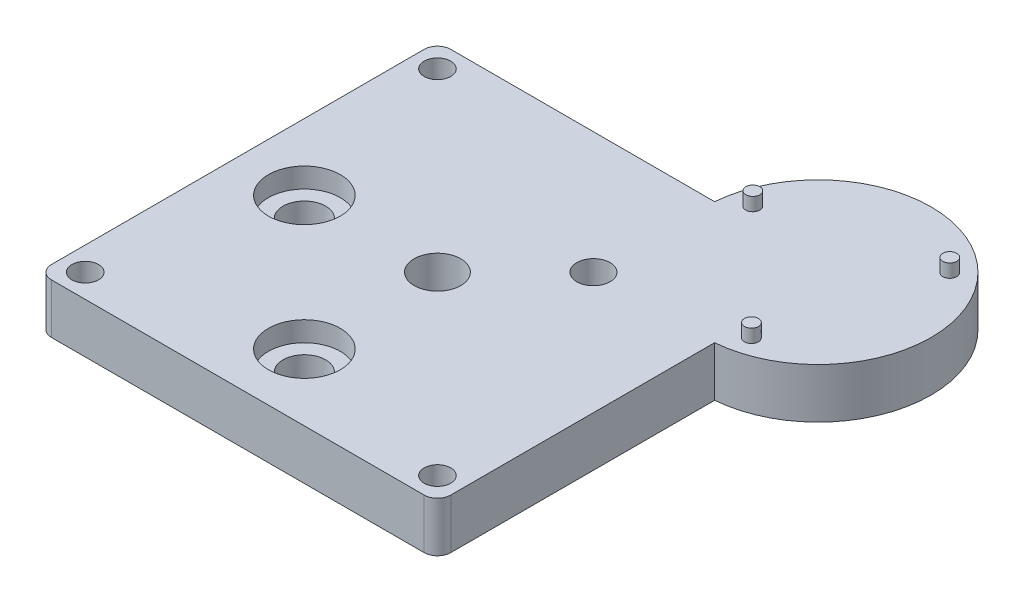
ISO-10303-21;
HEADER;
FILE_DESCRIPTION(('STEP AP214'),'2;1');
FILE_NAME('part.step','',(''),(''),'','','');
FILE_SCHEMA(('AUTOMOTIVE_DESIGN { 1 0 10303 214 1 1 1 1 }'));
ENDSEC;
DATA;
#1=APPLICATION_CONTEXT('core data for automotive mechanical design processes');
#2=APPLICATION_PROTOCOL_DEFINITION('international standard','automotive_design',2000,#1);
#3=PRODUCT_CONTEXT('',#1,'mechanical');
#4=PRODUCT('Part','Part','',(#3));
#5=PRODUCT_RELATED_PRODUCT_CATEGORY('part','',(#4));
#6=PRODUCT_DEFINITION_FORMATION('','',#4);
#7=PRODUCT_DEFINITION_CONTEXT('part definition',#1,'design');
#8=PRODUCT_DEFINITION('design','',#6,#7);
#9=PRODUCT_DEFINITION_SHAPE('','',#8);
#10=(LENGTH_UNIT() NAMED_UNIT(*) SI_UNIT(.MILLI.,.METRE.));
#11=(NAMED_UNIT(*) PLANE_ANGLE_UNIT() SI_UNIT($,.RADIAN.));
#12=(NAMED_UNIT(*) SI_UNIT($,.STERADIAN.) SOLID_ANGLE_UNIT());
#13=UNCERTAINTY_MEASURE_WITH_UNIT(LENGTH_MEASURE(1.E-05),#10,'distance_accuracy_value','');
#14=(GEOMETRIC_REPRESENTATION_CONTEXT(3) GLOBAL_UNCERTAINTY_ASSIGNED_CONTEXT((#13)) GLOBAL_UNIT_ASSIGNED_CONTEXT((#10,
#11,#12)) REPRESENTATION_CONTEXT('',''));
#15=CARTESIAN_POINT('',(0.,0.,0.));
#16=DIRECTION('',(0.,0.,1.));
#17=DIRECTION('',(1.,0.,0.));
#18=AXIS2_PLACEMENT_3D('',#15,#16,#17);
#19=CARTESIAN_POINT('',(38.1,9.525,-38.1));
#20=DIRECTION('',(-1.,0.,0.));
#21=DIRECTION('',(0.,0.,1.));
#22=AXIS2_PLACEMENT_3D('',#19,#20,#21);
#23=PLANE('',#22);
#24=DIRECTION('',(0.,0.,-1.));
#25=VECTOR('',#24,1.);
#26=CARTESIAN_POINT('',(38.1,0.,-38.1));
#27=LINE('',#26,#25);
#28=CARTESIAN_POINT('',(38.1,0.,35.56));
#29=VERTEX_POINT('',#28);
#30=CARTESIAN_POINT('',(38.1,0.,-14.7955));
#31=VERTEX_POINT('',#30);
#32=EDGE_CURVE('E130',#29,#31,#27,.T.);
#33=ORIENTED_EDGE('',*,*,#32,.T.);
#34=DIRECTION('',(0.,1.,0.));
#35=VECTOR('',#34,1.);
#36=CARTESIAN_POINT('',(38.1,-61.0657416232702,-14.7955));
#37=LINE('',#36,#35);
#38=CARTESIAN_POINT('',(38.1,9.525,-14.7955));
#39=VERTEX_POINT('',#38);
#40=EDGE_CURVE('E109',#31,#39,#37,.T.);
#41=ORIENTED_EDGE('',*,*,#40,.T.);
#42=DIRECTION('',(0.,0.,-1.));
#43=VECTOR('',#42,1.);
#44=CARTESIAN_POINT('',(38.1,9.525,-38.1));
#45=LINE('',#44,#43);
#46=CARTESIAN_POINT('',(38.1,9.525,35.56));
#47=VERTEX_POINT('',#46);
#48=EDGE_CURVE('E140',#47,#39,#45,.T.);
#49=ORIENTED_EDGE('',*,*,#48,.F.);
#50=DIRECTION('',(0.,-1.,0.));
#51=VECTOR('',#50,1.);
#52=CARTESIAN_POINT('',(38.1,9.525,35.56));
#53=LINE('',#52,#51);
#54=EDGE_CURVE('E157',#47,#29,#53,.T.);
#55=ORIENTED_EDGE('',*,*,#54,.T.);
#56=EDGE_LOOP('',(#33,#41,#49,#55));
#57=FACE_BOUND('',#56,.T.);
#58=ADVANCED_FACE('F38',(#57),#23,.F.);
#59=CARTESIAN_POINT('',(-38.1,9.525,-38.1));
#60=DIRECTION('',(0.,0.,1.));
#61=DIRECTION('',(1.,0.,0.));
#62=AXIS2_PLACEMENT_3D('',#59,#60,#61);
#63=PLANE('',#62);
#64=DIRECTION('',(-1.,0.,0.));
#65=VECTOR('',#64,1.);
#66=CARTESIAN_POINT('',(-38.1,9.525,-38.1));
#67=LINE('',#66,#65);
#68=CARTESIAN_POINT('',(14.7955,9.525,-38.1));
#69=VERTEX_POINT('',#68);
#70=CARTESIAN_POINT('',(-35.56,9.525,-38.1));
#71=VERTEX_POINT('',#70);
#72=EDGE_CURVE('E122',#69,#71,#67,.T.);
#73=ORIENTED_EDGE('',*,*,#72,.F.);
#74=DIRECTION('',(0.,1.,0.));
#75=VECTOR('',#74,1.);
#76=CARTESIAN_POINT('',(14.7955,-61.0657416232702,-38.1));
#77=LINE('',#76,#75);
#78=CARTESIAN_POINT('',(14.7955,0.,-38.1));
#79=VERTEX_POINT('',#78);
#80=EDGE_CURVE('E106',#69,#79,#77,.F.);
#81=ORIENTED_EDGE('',*,*,#80,.T.);
#82=DIRECTION('',(-1.,0.,0.));
#83=VECTOR('',#82,1.);
#84=CARTESIAN_POINT('',(-38.1,0.,-38.1));
#85=LINE('',#84,#83);
#86=CARTESIAN_POINT('',(-35.56,0.,-38.1));
#87=VERTEX_POINT('',#86);
#88=EDGE_CURVE('E120',#79,#87,#85,.T.);
#89=ORIENTED_EDGE('',*,*,#88,.T.);
#90=DIRECTION('',(0.,-1.,0.));
#91=VECTOR('',#90,1.);
#92=CARTESIAN_POINT('',(-35.56,9.525,-38.1));
#93=LINE('',#92,#91);
#94=EDGE_CURVE('E149',#87,#71,#93,.F.);
#95=ORIENTED_EDGE('',*,*,#94,.T.);
#96=EDGE_LOOP('',(#73,#81,#89,#95));
#97=FACE_BOUND('',#96,.T.);
#98=ADVANCED_FACE('F118',(#97),#63,.F.);
#99=CARTESIAN_POINT('',(-38.1,9.525,-38.1));
#100=DIRECTION('',(1.,0.,0.));
#101=DIRECTION('',(0.,0.,-1.));
#102=AXIS2_PLACEMENT_3D('',#99,#100,#101);
#103=PLANE('',#102);
#104=DIRECTION('',(0.,0.,1.));
#105=VECTOR('',#104,1.);
#106=CARTESIAN_POINT('',(-38.1,0.,-38.1));
#107=LINE('',#106,#105);
#108=CARTESIAN_POINT('',(-38.1,0.,-35.56));
#109=VERTEX_POINT('',#108);
#110=CARTESIAN_POINT('',(-38.1,0.,35.56));
#111=VERTEX_POINT('',#110);
#112=EDGE_CURVE('E129',#109,#111,#107,.T.);
#113=ORIENTED_EDGE('',*,*,#112,.T.);
#114=DIRECTION('',(0.,-1.,0.));
#115=VECTOR('',#114,1.);
#116=CARTESIAN_POINT('',(-38.1,9.525,35.56));
#117=LINE('',#116,#115);
#118=CARTESIAN_POINT('',(-38.1,9.525,35.56));
#119=VERTEX_POINT('',#118);
#120=EDGE_CURVE('E11',#111,#119,#117,.F.);
#121=ORIENTED_EDGE('',*,*,#120,.T.);
#122=DIRECTION('',(0.,0.,1.));
#123=VECTOR('',#122,1.);
#124=CARTESIAN_POINT('',(-38.1,9.525,-38.1));
#125=LINE('',#124,#123);
#126=CARTESIAN_POINT('',(-38.1,9.525,-35.56));
#127=VERTEX_POINT('',#126);
#128=EDGE_CURVE('E174',#127,#119,#125,.T.);
#129=ORIENTED_EDGE('',*,*,#128,.F.);
#130=DIRECTION('',(0.,-1.,0.));
#131=VECTOR('',#130,1.);
#132=CARTESIAN_POINT('',(-38.1,9.525,-35.56));
#133=LINE('',#132,#131);
#134=EDGE_CURVE('E46',#127,#109,#133,.T.);
#135=ORIENTED_EDGE('',*,*,#134,.T.);
#136=EDGE_LOOP('',(#113,#121,#129,#135));
#137=FACE_BOUND('',#136,.T.);
#138=ADVANCED_FACE('F172',(#137),#103,.F.);
#139=CARTESIAN_POINT('',(-38.1,9.525,38.1));
#140=DIRECTION('',(0.,0.,-1.));
#141=DIRECTION('',(-1.,0.,0.));
#142=AXIS2_PLACEMENT_3D('',#139,#140,#141);
#143=PLANE('',#142);
#144=DIRECTION('',(1.,0.,0.));
#145=VECTOR('',#144,1.);
#146=CARTESIAN_POINT('',(-38.1,0.,38.1));
#147=LINE('',#146,#145);
#148=CARTESIAN_POINT('',(-35.56,0.,38.1));
#149=VERTEX_POINT('',#148);
#150=CARTESIAN_POINT('',(35.56,0.,38.1));
#151=VERTEX_POINT('',#150);
#152=EDGE_CURVE('E133',#149,#151,#147,.T.);
#153=ORIENTED_EDGE('',*,*,#152,.T.);
#154=DIRECTION('',(0.,-1.,0.));
#155=VECTOR('',#154,1.);
#156=CARTESIAN_POINT('',(35.56,9.525,38.1));
#157=LINE('',#156,#155);
#158=CARTESIAN_POINT('',(35.56,9.525,38.1));
#159=VERTEX_POINT('',#158);
#160=EDGE_CURVE('E53',#151,#159,#157,.F.);
#161=ORIENTED_EDGE('',*,*,#160,.T.);
#162=DIRECTION('',(1.,0.,0.));
#163=VECTOR('',#162,1.);
#164=CARTESIAN_POINT('',(-38.1,9.525,38.1));
#165=LINE('',#164,#163);
#166=CARTESIAN_POINT('',(-35.56,9.525,38.1));
#167=VERTEX_POINT('',#166);
#168=EDGE_CURVE('E151',#167,#159,#165,.T.);
#169=ORIENTED_EDGE('',*,*,#168,.F.);
#170=DIRECTION('',(0.,-1.,0.));
#171=VECTOR('',#170,1.);
#172=CARTESIAN_POINT('',(-35.56,9.525,38.1));
#173=LINE('',#172,#171);
#174=EDGE_CURVE('E165',#167,#149,#173,.T.);
#175=ORIENTED_EDGE('',*,*,#174,.T.);
#176=EDGE_LOOP('',(#153,#161,#169,#175));
#177=FACE_BOUND('',#176,.T.);
#178=ADVANCED_FACE('F181',(#177),#143,.F.);
#179=CARTESIAN_POINT('',(0.,9.525,0.));
#180=DIRECTION('',(0.,1.,0.));
#181=DIRECTION('',(0.,0.,1.));
#182=AXIS2_PLACEMENT_3D('',#179,#180,#181);
#183=PLANE('',#182);
#184=CARTESIAN_POINT('',(33.6098719394654,9.525,33.6098719394654));
#185=DIRECTION('',(0.,1.,0.));
#186=DIRECTION('',(0.,0.,1.));
#187=AXIS2_PLACEMENT_3D('',#184,#185,#186);
#188=CIRCLE('',#187,2.54);
#189=CARTESIAN_POINT('',(33.6098719394654,9.525,36.1498719394654));
#190=VERTEX_POINT('',#189);
#191=EDGE_CURVE('E257',#190,#190,#188,.T.);
#192=ORIENTED_EDGE('',*,*,#191,.F.);
#193=EDGE_LOOP('',(#192));
#194=FACE_BOUND('',#193,.T.);
#195=CARTESIAN_POINT('',(-33.6098719394654,9.525,-33.6098719394654));
#196=DIRECTION('',(0.,1.,0.));
#197=DIRECTION('',(0.,0.,1.));
#198=AXIS2_PLACEMENT_3D('',#195,#196,#197);
#199=CIRCLE('',#198,2.54);
#200=CARTESIAN_POINT('',(-33.6098719394654,9.525,-31.0698719394654));
#201=VERTEX_POINT('',#200);
#202=EDGE_CURVE('E258',#201,#201,#199,.T.);
#203=ORIENTED_EDGE('',*,*,#202,.F.);
#204=EDGE_LOOP('',(#203));
#205=FACE_BOUND('',#204,.T.);
#206=CARTESIAN_POINT('',(14.883511114308,9.525,-14.883511114308));
#207=DIRECTION('',(0.,1.,0.));
#208=DIRECTION('',(0.,0.,1.));
#209=AXIS2_PLACEMENT_3D('',#206,#207,#208);
#210=CIRCLE('',#209,3.175);
#211=CARTESIAN_POINT('',(14.883511114308,9.525,-11.708511114308));
#212=VERTEX_POINT('',#211);
#213=EDGE_CURVE('E268',#212,#212,#210,.T.);
#214=ORIENTED_EDGE('',*,*,#213,.F.);
#215=EDGE_LOOP('',(#214));
#216=FACE_BOUND('',#215,.T.);
#217=CARTESIAN_POINT('',(-33.6098719394654,9.525,33.6098719394654));
#218=DIRECTION('',(0.,1.,0.));
#219=DIRECTION('',(0.,0.,1.));
#220=AXIS2_PLACEMENT_3D('',#217,#218,#219);
#221=CIRCLE('',#220,2.54);
#222=CARTESIAN_POINT('',(-33.6098719394654,9.525,36.1498719394654));
#223=VERTEX_POINT('',#222);
#224=EDGE_CURVE('E250',#223,#223,#221,.T.);
#225=ORIENTED_EDGE('',*,*,#224,.F.);
#226=EDGE_LOOP('',(#225));
#227=FACE_BOUND('',#226,.T.);
#228=CARTESIAN_POINT('',(40.805299824475,9.525,-19.1085964891355));
#229=DIRECTION('',(0.,1.,0.));
#230=DIRECTION('',(0.,0.,1.));
#231=AXIS2_PLACEMENT_3D('',#228,#229,#230);
#232=CIRCLE('',#231,1.3335);
#233=CARTESIAN_POINT('',(40.805299824475,9.525,-17.7750964891355));
#234=VERTEX_POINT('',#233);
#235=EDGE_CURVE('E242',#234,#234,#232,.T.);
#236=ORIENTED_EDGE('',*,*,#235,.F.);
#237=EDGE_LOOP('',(#236));
#238=FACE_BOUND('',#237,.T.);
#239=CARTESIAN_POINT('',(48.9622185330729,9.525,-48.8045537422925));
#240=DIRECTION('',(0.,1.,0.));
#241=DIRECTION('',(0.,0.,1.));
#242=AXIS2_PLACEMENT_3D('',#239,#240,#241);
#243=CIRCLE('',#242,1.3335);
#244=CARTESIAN_POINT('',(48.9622185330729,9.525,-47.4710537422925));
#245=VERTEX_POINT('',#244);
#246=EDGE_CURVE('E236',#245,#245,#243,.T.);
#247=ORIENTED_EDGE('',*,*,#246,.F.);
#248=EDGE_LOOP('',(#247));
#249=FACE_BOUND('',#248,.T.);
#250=CARTESIAN_POINT('',(19.1663058078433,9.525,-41.0206739339643));
#251=DIRECTION('',(0.,1.,0.));
#252=DIRECTION('',(0.,0.,1.));
#253=AXIS2_PLACEMENT_3D('',#250,#251,#252);
#254=CIRCLE('',#253,1.3335);
#255=CARTESIAN_POINT('',(19.1663058078433,9.525,-39.6871739339643));
#256=VERTEX_POINT('',#255);
#257=EDGE_CURVE('E230',#256,#256,#254,.T.);
#258=ORIENTED_EDGE('',*,*,#257,.F.);
#259=EDGE_LOOP('',(#258));
#260=FACE_BOUND('',#259,.T.);
#261=CARTESIAN_POINT('',(36.311274721797,9.525,-36.311274721797));
#262=DIRECTION('',(0.,1.,0.));
#263=DIRECTION('',(0.,0.,1.));
#264=AXIS2_PLACEMENT_3D('',#261,#262,#263);
#265=CIRCLE('',#264,21.59);
#266=EDGE_CURVE('E114',#39,#69,#265,.T.);
#267=ORIENTED_EDGE('',*,*,#266,.T.);
#268=ORIENTED_EDGE('',*,*,#72,.T.);
#269=CARTESIAN_POINT('',(-35.56,9.525,-35.56));
#270=DIRECTION('',(0.,1.,0.));
#271=DIRECTION('',(0.,0.,1.));
#272=AXIS2_PLACEMENT_3D('',#269,#270,#271);
#273=CIRCLE('',#272,2.54);
#274=EDGE_CURVE('E160',#71,#127,#273,.T.);
#275=ORIENTED_EDGE('',*,*,#274,.T.);
#276=ORIENTED_EDGE('',*,*,#128,.T.);
#277=CARTESIAN_POINT('',(-35.56,9.525,35.56));
#278=DIRECTION('',(0.,1.,0.));
#279=DIRECTION('',(0.,0.,1.));
#280=AXIS2_PLACEMENT_3D('',#277,#278,#279);
#281=CIRCLE('',#280,2.54);
#282=EDGE_CURVE('E60',#119,#167,#281,.T.);
#283=ORIENTED_EDGE('',*,*,#282,.T.);
#284=ORIENTED_EDGE('',*,*,#168,.T.);
#285=CARTESIAN_POINT('',(35.56,9.525,35.56));
#286=DIRECTION('',(0.,1.,0.));
#287=DIRECTION('',(0.,0.,1.));
#288=AXIS2_PLACEMENT_3D('',#285,#286,#287);
#289=CIRCLE('',#288,2.54);
#290=EDGE_CURVE('E163',#159,#47,#289,.T.);
#291=ORIENTED_EDGE('',*,*,#290,.T.);
#292=ORIENTED_EDGE('',*,*,#48,.T.);
#293=EDGE_LOOP('',(#267,#268,#275,#276,#283,#284,#291,#292));
#294=FACE_BOUND('',#293,.T.);
#295=CARTESIAN_POINT('',(0.,9.525,0.));
#296=DIRECTION('',(0.,1.,0.));
#297=DIRECTION('',(0.,0.,1.));
#298=AXIS2_PLACEMENT_3D('',#295,#296,#297);
#299=CIRCLE('',#298,4.445);
#300=CARTESIAN_POINT('',(0.,9.525,4.445));
#301=VERTEX_POINT('',#300);
#302=EDGE_CURVE('E224',#301,#301,#299,.T.);
#303=ORIENTED_EDGE('',*,*,#302,.F.);
#304=EDGE_LOOP('',(#303));
#305=FACE_BOUND('',#304,.T.);
#306=CARTESIAN_POINT('',(0.,9.525,25.4));
#307=DIRECTION('',(0.,-1.,0.));
#308=DIRECTION('',(0.,0.,-1.));
#309=AXIS2_PLACEMENT_3D('',#306,#307,#308);
#310=CIRCLE('',#309,6.858);
#311=CARTESIAN_POINT('',(0.,9.525,32.258));
#312=VERTEX_POINT('',#311);
#313=EDGE_CURVE('E211',#312,#312,#310,.T.);
#314=ORIENTED_EDGE('',*,*,#313,.T.);
#315=EDGE_LOOP('',(#314));
#316=FACE_BOUND('',#315,.T.);
#317=CARTESIAN_POINT('',(-25.4,9.525,0.));
#318=DIRECTION('',(0.,-1.,0.));
#319=DIRECTION('',(0.,0.,-1.));
#320=AXIS2_PLACEMENT_3D('',#317,#318,#319);
#321=CIRCLE('',#320,6.858);
#322=CARTESIAN_POINT('',(-25.4,9.525,6.85800000000001));
#323=VERTEX_POINT('',#322);
#324=EDGE_CURVE('E204',#323,#323,#321,.T.);
#325=ORIENTED_EDGE('',*,*,#324,.T.);
#326=EDGE_LOOP('',(#325));
#327=FACE_BOUND('',#326,.T.);
#328=ADVANCED_FACE('F275',(#194,#205,#216,#227,#238,#249,#260,#294,#305,#316,#327),#183,.T.);
#329=CARTESIAN_POINT('',(0.,0.,0.));
#330=DIRECTION('',(0.,1.,0.));
#331=DIRECTION('',(0.,0.,1.));
#332=AXIS2_PLACEMENT_3D('',#329,#330,#331);
#333=PLANE('',#332);
#334=CARTESIAN_POINT('',(33.6098719394654,0.,33.6098719394654));
#335=DIRECTION('',(0.,1.,0.));
#336=DIRECTION('',(0.,0.,1.));
#337=AXIS2_PLACEMENT_3D('',#334,#335,#336);
#338=CIRCLE('',#337,2.54);
#339=CARTESIAN_POINT('',(33.6098719394654,0.,36.1498719394654));
#340=VERTEX_POINT('',#339);
#341=EDGE_CURVE('E253',#340,#340,#338,.F.);
#342=ORIENTED_EDGE('',*,*,#341,.F.);
#343=EDGE_LOOP('',(#342));
#344=FACE_BOUND('',#343,.T.);
#345=CARTESIAN_POINT('',(-33.6098719394654,0.,-33.6098719394654));
#346=DIRECTION('',(0.,1.,0.));
#347=DIRECTION('',(0.,0.,1.));
#348=AXIS2_PLACEMENT_3D('',#345,#346,#347);
#349=CIRCLE('',#348,2.54);
#350=CARTESIAN_POINT('',(-33.6098719394654,0.,-31.0698719394654));
#351=VERTEX_POINT('',#350);
#352=EDGE_CURVE('E254',#351,#351,#349,.F.);
#353=ORIENTED_EDGE('',*,*,#352,.F.);
#354=EDGE_LOOP('',(#353));
#355=FACE_BOUND('',#354,.T.);
#356=CARTESIAN_POINT('',(14.883511114308,0.,-14.883511114308));
#357=DIRECTION('',(0.,1.,0.));
#358=DIRECTION('',(0.,0.,1.));
#359=AXIS2_PLACEMENT_3D('',#356,#357,#358);
#360=CIRCLE('',#359,3.175);
#361=CARTESIAN_POINT('',(14.883511114308,0.,-11.708511114308));
#362=VERTEX_POINT('',#361);
#363=EDGE_CURVE('E261',#362,#362,#360,.F.);
#364=ORIENTED_EDGE('',*,*,#363,.F.);
#365=EDGE_LOOP('',(#364));
#366=FACE_BOUND('',#365,.T.);
#367=CARTESIAN_POINT('',(-33.6098719394654,0.,33.6098719394654));
#368=DIRECTION('',(0.,1.,0.));
#369=DIRECTION('',(0.,0.,1.));
#370=AXIS2_PLACEMENT_3D('',#367,#368,#369);
#371=CIRCLE('',#370,2.54);
#372=CARTESIAN_POINT('',(-33.6098719394654,0.,36.1498719394654));
#373=VERTEX_POINT('',#372);
#374=EDGE_CURVE('E245',#373,#373,#371,.F.);
#375=ORIENTED_EDGE('',*,*,#374,.F.);
#376=EDGE_LOOP('',(#375));
#377=FACE_BOUND('',#376,.T.);
#378=ORIENTED_EDGE('',*,*,#88,.F.);
#379=CARTESIAN_POINT('',(36.311274721797,0.,-36.311274721797));
#380=DIRECTION('',(0.,1.,0.));
#381=DIRECTION('',(0.,0.,1.));
#382=AXIS2_PLACEMENT_3D('',#379,#380,#381);
#383=CIRCLE('',#382,21.59);
#384=EDGE_CURVE('E103',#79,#31,#383,.F.);
#385=ORIENTED_EDGE('',*,*,#384,.T.);
#386=ORIENTED_EDGE('',*,*,#32,.F.);
#387=CARTESIAN_POINT('',(35.56,0.,35.56));
#388=DIRECTION('',(0.,1.,0.));
#389=DIRECTION('',(0.,0.,1.));
#390=AXIS2_PLACEMENT_3D('',#387,#388,#389);
#391=CIRCLE('',#390,2.54);
#392=EDGE_CURVE('E155',#29,#151,#391,.F.);
#393=ORIENTED_EDGE('',*,*,#392,.T.);
#394=ORIENTED_EDGE('',*,*,#152,.F.);
#395=CARTESIAN_POINT('',(-35.56,0.,35.56));
#396=DIRECTION('',(0.,1.,0.));
#397=DIRECTION('',(0.,0.,1.));
#398=AXIS2_PLACEMENT_3D('',#395,#396,#397);
#399=CIRCLE('',#398,2.54);
#400=EDGE_CURVE('E153',#149,#111,#399,.F.);
#401=ORIENTED_EDGE('',*,*,#400,.T.);
#402=ORIENTED_EDGE('',*,*,#112,.F.);
#403=CARTESIAN_POINT('',(-35.56,0.,-35.56));
#404=DIRECTION('',(0.,1.,0.));
#405=DIRECTION('',(0.,0.,1.));
#406=AXIS2_PLACEMENT_3D('',#403,#404,#405);
#407=CIRCLE('',#406,2.54);
#408=EDGE_CURVE('E127',#109,#87,#407,.F.);
#409=ORIENTED_EDGE('',*,*,#408,.T.);
#410=EDGE_LOOP('',(#378,#385,#386,#393,#394,#401,#402,#409));
#411=FACE_BOUND('',#410,.T.);
#412=CARTESIAN_POINT('',(0.,0.,0.));
#413=DIRECTION('',(0.,1.,0.));
#414=DIRECTION('',(0.,0.,1.));
#415=AXIS2_PLACEMENT_3D('',#412,#413,#414);
#416=CIRCLE('',#415,4.445);
#417=CARTESIAN_POINT('',(0.,0.,4.445));
#418=VERTEX_POINT('',#417);
#419=EDGE_CURVE('E221',#418,#418,#416,.F.);
#420=ORIENTED_EDGE('',*,*,#419,.F.);
#421=EDGE_LOOP('',(#420));
#422=FACE_BOUND('',#421,.T.);
#423=CARTESIAN_POINT('',(-27.94,0.,27.94));
#424=DIRECTION('',(0.,1.,0.));
#425=DIRECTION('',(0.,0.,1.));
#426=AXIS2_PLACEMENT_3D('',#423,#424,#425);
#427=CIRCLE('',#426,4.44499999999999);
#428=CARTESIAN_POINT('',(-27.94,0.,32.385));
#429=VERTEX_POINT('',#428);
#430=EDGE_CURVE('E218',#429,#429,#427,.T.);
#431=ORIENTED_EDGE('',*,*,#430,.T.);
#432=EDGE_LOOP('',(#431));
#433=FACE_BOUND('',#432,.T.);
#434=CARTESIAN_POINT('',(-25.4,0.,0.));
#435=DIRECTION('',(0.,1.,0.));
#436=DIRECTION('',(0.,0.,1.));
#437=AXIS2_PLACEMENT_3D('',#434,#435,#436);
#438=CIRCLE('',#437,4.064);
#439=CARTESIAN_POINT('',(-25.4,0.,4.06400000000001));
#440=VERTEX_POINT('',#439);
#441=EDGE_CURVE('E195',#440,#440,#438,.F.);
#442=ORIENTED_EDGE('',*,*,#441,.F.);
#443=EDGE_LOOP('',(#442));
#444=FACE_BOUND('',#443,.T.);
#445=CARTESIAN_POINT('',(0.,0.,25.4));
#446=DIRECTION('',(0.,1.,0.));
#447=DIRECTION('',(0.,0.,1.));
#448=AXIS2_PLACEMENT_3D('',#445,#446,#447);
#449=CIRCLE('',#448,4.064);
#450=CARTESIAN_POINT('',(0.,0.,29.464));
#451=VERTEX_POINT('',#450);
#452=EDGE_CURVE('E148',#451,#451,#449,.F.);
#453=ORIENTED_EDGE('',*,*,#452,.F.);
#454=EDGE_LOOP('',(#453));
#455=FACE_BOUND('',#454,.T.);
#456=CARTESIAN_POINT('',(-27.323692654717,0.,-27.323692654717));
#457=DIRECTION('',(0.,1.,0.));
#458=DIRECTION('',(0.,0.,1.));
#459=AXIS2_PLACEMENT_3D('',#456,#457,#458);
#460=CIRCLE('',#459,3.81);
#461=CARTESIAN_POINT('',(-27.323692654717,0.,-23.513692654717));
#462=VERTEX_POINT('',#461);
#463=EDGE_CURVE('E191',#462,#462,#460,.T.);
#464=ORIENTED_EDGE('',*,*,#463,.T.);
#465=EDGE_LOOP('',(#464));
#466=FACE_BOUND('',#465,.T.);
#467=CARTESIAN_POINT('',(27.323692654717,0.,27.323692654717));
#468=DIRECTION('',(0.,1.,0.));
#469=DIRECTION('',(0.,0.,1.));
#470=AXIS2_PLACEMENT_3D('',#467,#468,#469);
#471=CIRCLE('',#470,3.81);
#472=CARTESIAN_POINT('',(27.323692654717,0.,31.133692654717));
#473=VERTEX_POINT('',#472);
#474=EDGE_CURVE('E192',#473,#473,#471,.T.);
#475=ORIENTED_EDGE('',*,*,#474,.T.);
#476=EDGE_LOOP('',(#475));
#477=FACE_BOUND('',#476,.T.);
#478=ADVANCED_FACE('F124',(#344,#355,#366,#377,#411,#422,#433,#444,#455,#466,#477),#333,.F.);
#479=CARTESIAN_POINT('',(27.323692654717,0.,27.323692654717));
#480=DIRECTION('',(0.,-1.,0.));
#481=DIRECTION('',(0.,0.,1.));
#482=AXIS2_PLACEMENT_3D('',#479,#480,#481);
#483=CONICAL_SURFACE('',#482,3.81,0.5235987755983);
#484=CARTESIAN_POINT('',(27.323692654717,2.54,27.323692654717));
#485=DIRECTION('',(0.,1.,0.));
#486=DIRECTION('',(0.,0.,1.));
#487=AXIS2_PLACEMENT_3D('',#484,#485,#486);
#488=CIRCLE('',#487,2.34353031625835);
#489=CARTESIAN_POINT('',(27.323692654717,2.54,29.6672229709754));
#490=VERTEX_POINT('',#489);
#491=EDGE_CURVE('E188',#490,#490,#488,.T.);
#492=ORIENTED_EDGE('',*,*,#491,.T.);
#493=EDGE_LOOP('',(#492));
#494=FACE_BOUND('',#493,.T.);
#495=ORIENTED_EDGE('',*,*,#474,.F.);
#496=EDGE_LOOP('',(#495));
#497=FACE_BOUND('',#496,.T.);
#498=ADVANCED_FACE('F370',(#494,#497),#483,.F.);
#499=CARTESIAN_POINT('',(27.323692654717,2.54,27.323692654717));
#500=DIRECTION('',(0.,1.,0.));
#501=DIRECTION('',(0.,0.,1.));
#502=AXIS2_PLACEMENT_3D('',#499,#500,#501);
#503=PLANE('',#502);
#504=ORIENTED_EDGE('',*,*,#491,.F.);
#505=EDGE_LOOP('',(#504));
#506=FACE_BOUND('',#505,.T.);
#507=ADVANCED_FACE('F378',(#506),#503,.F.);
#508=CARTESIAN_POINT('',(-27.323692654717,0.,-27.323692654717));
#509=DIRECTION('',(0.,-1.,0.));
#510=DIRECTION('',(0.,0.,1.));
#511=AXIS2_PLACEMENT_3D('',#508,#509,#510);
#512=CONICAL_SURFACE('',#511,3.81,0.5235987755983);
#513=CARTESIAN_POINT('',(-27.323692654717,2.54,-27.323692654717));
#514=DIRECTION('',(0.,1.,0.));
#515=DIRECTION('',(0.,0.,1.));
#516=AXIS2_PLACEMENT_3D('',#513,#514,#515);
#517=CIRCLE('',#516,2.34353031625835);
#518=CARTESIAN_POINT('',(-27.323692654717,2.54,-24.9801623384587));
#519=VERTEX_POINT('',#518);
#520=EDGE_CURVE('E135',#519,#519,#517,.T.);
#521=ORIENTED_EDGE('',*,*,#520,.T.);
#522=EDGE_LOOP('',(#521));
#523=FACE_BOUND('',#522,.T.);
#524=ORIENTED_EDGE('',*,*,#463,.F.);
#525=EDGE_LOOP('',(#524));
#526=FACE_BOUND('',#525,.T.);
#527=ADVANCED_FACE('F384',(#523,#526),#512,.F.);
#528=CARTESIAN_POINT('',(-27.323692654717,2.54,-27.323692654717));
#529=DIRECTION('',(0.,1.,0.));
#530=DIRECTION('',(0.,0.,1.));
#531=AXIS2_PLACEMENT_3D('',#528,#529,#530);
#532=PLANE('',#531);
#533=ORIENTED_EDGE('',*,*,#520,.F.);
#534=EDGE_LOOP('',(#533));
#535=FACE_BOUND('',#534,.T.);
#536=ADVANCED_FACE('F364',(#535),#532,.F.);
#537=CARTESIAN_POINT('',(0.,-0.000999999999999265,25.4));
#538=DIRECTION('',(0.,1.,0.));
#539=DIRECTION('',(0.,0.,1.));
#540=AXIS2_PLACEMENT_3D('',#537,#538,#539);
#541=CYLINDRICAL_SURFACE('',#540,4.064);
#542=CARTESIAN_POINT('',(0.,5.715,25.4));
#543=DIRECTION('',(0.,-1.,0.));
#544=DIRECTION('',(0.,0.,-1.));
#545=AXIS2_PLACEMENT_3D('',#542,#543,#544);
#546=CIRCLE('',#545,4.064);
#547=CARTESIAN_POINT('',(0.,5.715,21.336));
#548=VERTEX_POINT('',#547);
#549=EDGE_CURVE('E144',#548,#548,#546,.F.);
#550=ORIENTED_EDGE('',*,*,#549,.T.);
#551=EDGE_LOOP('',(#550));
#552=FACE_BOUND('',#551,.T.);
#553=ORIENTED_EDGE('',*,*,#452,.T.);
#554=EDGE_LOOP('',(#553));
#555=FACE_BOUND('',#554,.T.);
#556=ADVANCED_FACE('F361',(#552,#555),#541,.F.);
#557=CARTESIAN_POINT('',(-25.4,-0.000999999999999265,0.));
#558=DIRECTION('',(0.,1.,0.));
#559=DIRECTION('',(0.,0.,1.));
#560=AXIS2_PLACEMENT_3D('',#557,#558,#559);
#561=CYLINDRICAL_SURFACE('',#560,4.064);
#562=CARTESIAN_POINT('',(-25.4,5.715,0.));
#563=DIRECTION('',(0.,-1.,0.));
#564=DIRECTION('',(0.,0.,-1.));
#565=AXIS2_PLACEMENT_3D('',#562,#563,#564);
#566=CIRCLE('',#565,4.064);
#567=CARTESIAN_POINT('',(-25.4,5.715,-4.06399999999999));
#568=VERTEX_POINT('',#567);
#569=EDGE_CURVE('E141',#568,#568,#566,.F.);
#570=ORIENTED_EDGE('',*,*,#569,.T.);
#571=EDGE_LOOP('',(#570));
#572=FACE_BOUND('',#571,.T.);
#573=ORIENTED_EDGE('',*,*,#441,.T.);
#574=EDGE_LOOP('',(#573));
#575=FACE_BOUND('',#574,.T.);
#576=ADVANCED_FACE('F307',(#572,#575),#561,.F.);
#577=CARTESIAN_POINT('',(-25.4,5.715,0.));
#578=DIRECTION('',(0.,-1.,0.));
#579=DIRECTION('',(0.,0.,-1.));
#580=AXIS2_PLACEMENT_3D('',#577,#578,#579);
#581=PLANE('',#580);
#582=CARTESIAN_POINT('',(-25.4,5.715,0.));
#583=DIRECTION('',(0.,-1.,0.));
#584=DIRECTION('',(0.,0.,-1.));
#585=AXIS2_PLACEMENT_3D('',#582,#583,#584);
#586=CIRCLE('',#585,6.858);
#587=CARTESIAN_POINT('',(-25.4,5.715,6.85800000000001));
#588=VERTEX_POINT('',#587);
#589=EDGE_CURVE('E207',#588,#588,#586,.T.);
#590=ORIENTED_EDGE('',*,*,#589,.F.);
#591=EDGE_LOOP('',(#590));
#592=FACE_BOUND('',#591,.T.);
#593=ORIENTED_EDGE('',*,*,#569,.F.);
#594=EDGE_LOOP('',(#593));
#595=FACE_BOUND('',#594,.T.);
#596=ADVANCED_FACE('F297',(#592,#595),#581,.F.);
#597=CARTESIAN_POINT('',(-25.4,5.715,0.));
#598=DIRECTION('',(0.,1.,0.));
#599=DIRECTION('',(0.,0.,1.));
#600=AXIS2_PLACEMENT_3D('',#597,#598,#599);
#601=CYLINDRICAL_SURFACE('',#600,6.858);
#602=CARTESIAN_POINT('',(-25.4,5.715,6.85800000000001));
#603=CARTESIAN_POINT('',(-25.4,5.7546875,6.85800000000001));
#604=CARTESIAN_POINT('',(-25.4,5.794375,6.85800000000001));
#605=CARTESIAN_POINT('',(-25.4,5.87375,6.85800000000001));
#606=CARTESIAN_POINT('',(-25.4,5.9134375,6.85800000000001));
#607=CARTESIAN_POINT('',(-25.4,5.9928125,6.85800000000001));
#608=CARTESIAN_POINT('',(-25.4,6.0325,6.85800000000001));
#609=CARTESIAN_POINT('',(-25.4,6.111875,6.85800000000001));
#610=CARTESIAN_POINT('',(-25.4,6.1515625,6.85800000000001));
#611=CARTESIAN_POINT('',(-25.4,6.2309375,6.85800000000001));
#612=CARTESIAN_POINT('',(-25.4,6.270625,6.85800000000001));
#613=CARTESIAN_POINT('',(-25.4,6.35,6.85800000000001));
#614=CARTESIAN_POINT('',(-25.4,6.3896875,6.85800000000001));
#615=CARTESIAN_POINT('',(-25.4,6.4690625,6.85800000000001));
#616=CARTESIAN_POINT('',(-25.4,6.50875,6.85800000000001));
#617=CARTESIAN_POINT('',(-25.4,6.588125,6.85800000000001));
#618=CARTESIAN_POINT('',(-25.4,6.6278125,6.85800000000001));
#619=CARTESIAN_POINT('',(-25.4,6.7071875,6.85800000000001));
#620=CARTESIAN_POINT('',(-25.4,6.746875,6.85800000000001));
#621=CARTESIAN_POINT('',(-25.4,6.82625,6.85800000000001));
#622=CARTESIAN_POINT('',(-25.4,6.8659375,6.85800000000001));
#623=CARTESIAN_POINT('',(-25.4,6.9453125,6.85800000000001));
#624=CARTESIAN_POINT('',(-25.4,6.985,6.85800000000001));
#625=CARTESIAN_POINT('',(-25.4,7.064375,6.85800000000001));
#626=CARTESIAN_POINT('',(-25.4,7.1040625,6.85800000000001));
#627=CARTESIAN_POINT('',(-25.4,7.1834375,6.85800000000001));
#628=CARTESIAN_POINT('',(-25.4,7.223125,6.85800000000001));
#629=CARTESIAN_POINT('',(-25.4,7.3025,6.85800000000001));
#630=CARTESIAN_POINT('',(-25.4,7.3421875,6.85800000000001));
#631=CARTESIAN_POINT('',(-25.4,7.4215625,6.85800000000001));
#632=CARTESIAN_POINT('',(-25.4,7.46125,6.85800000000001));
#633=CARTESIAN_POINT('',(-25.4,7.540625,6.85800000000001));
#634=CARTESIAN_POINT('',(-25.4,7.5803125,6.85800000000001));
#635=CARTESIAN_POINT('',(-25.4,7.6596875,6.85800000000001));
#636=CARTESIAN_POINT('',(-25.4,7.699375,6.85800000000001));
#637=CARTESIAN_POINT('',(-25.4,7.77875,6.85800000000001));
#638=CARTESIAN_POINT('',(-25.4,7.8184375,6.85800000000001));
#639=CARTESIAN_POINT('',(-25.4,7.8978125,6.85800000000001));
#640=CARTESIAN_POINT('',(-25.4,7.9375,6.85800000000001));
#641=CARTESIAN_POINT('',(-25.4,8.016875,6.85800000000001));
#642=CARTESIAN_POINT('',(-25.4,8.0565625,6.85800000000001));
#643=CARTESIAN_POINT('',(-25.4,8.1359375,6.85800000000001));
#644=CARTESIAN_POINT('',(-25.4,8.175625,6.85800000000001));
#645=CARTESIAN_POINT('',(-25.4,8.255,6.85800000000001));
#646=CARTESIAN_POINT('',(-25.4,8.2946875,6.85800000000001));
#647=CARTESIAN_POINT('',(-25.4,8.3740625,6.85800000000001));
#648=CARTESIAN_POINT('',(-25.4,8.41375,6.85800000000001));
#649=CARTESIAN_POINT('',(-25.4,8.493125,6.85800000000001));
#650=CARTESIAN_POINT('',(-25.4,8.5328125,6.85800000000001));
#651=CARTESIAN_POINT('',(-25.4,8.6121875,6.85800000000001));
#652=CARTESIAN_POINT('',(-25.4,8.651875,6.85800000000001));
#653=CARTESIAN_POINT('',(-25.4,8.73125,6.85800000000001));
#654=CARTESIAN_POINT('',(-25.4,8.7709375,6.85800000000001));
#655=CARTESIAN_POINT('',(-25.4,8.8503125,6.85800000000001));
#656=CARTESIAN_POINT('',(-25.4,8.89,6.85800000000001));
#657=CARTESIAN_POINT('',(-25.4,8.969375,6.85800000000001));
#658=CARTESIAN_POINT('',(-25.4,9.0090625,6.85800000000001));
#659=CARTESIAN_POINT('',(-25.4,9.0884375,6.85800000000001));
#660=CARTESIAN_POINT('',(-25.4,9.128125,6.85800000000001));
#661=CARTESIAN_POINT('',(-25.4,9.2075,6.85800000000001));
#662=CARTESIAN_POINT('',(-25.4,9.2471875,6.85800000000001));
#663=CARTESIAN_POINT('',(-25.4,9.3265625,6.85800000000001));
#664=CARTESIAN_POINT('',(-25.4,9.36625,6.85800000000001));
#665=CARTESIAN_POINT('',(-25.4,9.445625,6.85800000000001));
#666=CARTESIAN_POINT('',(-25.4,9.4853125,6.85800000000001));
#667=CARTESIAN_POINT('',(-25.4,9.525,6.85800000000001));
#668=B_SPLINE_CURVE_WITH_KNOTS('',3,(#602,#603,#604,#605,#606,#607,#608,#609,#610,#611,#612,
#613,#614,#615,#616,#617,#618,#619,#620,#621,#622,#623,#624,#625,#626,#627,#628,#629,#630,#631,
#632,#633,#634,#635,#636,#637,#638,#639,#640,#641,#642,#643,#644,#645,#646,#647,#648,#649,#650,
#651,#652,#653,#654,#655,#656,#657,#658,#659,#660,#661,#662,#663,#664,#665,#666,#667),
.UNSPECIFIED.,.F.,.F.,(4,2,2,2,2,2,2,2,2,2,2,2,2,2,2,2,2,2,2,2,2,2,2,2,2,2,2,2,2,2,2,2,4),(0.,
0.1190625,0.238125,0.357187500000001,0.47625,0.5953125,0.714375000000001,0.8334375,0.9525,
1.0715625,1.190625,1.3096875,1.42875,1.5478125,1.666875,1.7859375,1.905,2.0240625,2.143125,
2.2621875,2.38125,2.5003125,2.619375,2.7384375,2.8575,2.9765625,3.095625,3.2146875,3.33375,
3.4528125,3.571875,3.6909375,3.81),.UNSPECIFIED.);
#669=EDGE_CURVE('BSEAM294',#588,#323,#668,.T.);
#670=ORIENTED_EDGE('',*,*,#589,.T.);
#671=ORIENTED_EDGE('',*,*,#324,.F.);
#672=ORIENTED_EDGE('',*,*,#669,.T.);
#673=ORIENTED_EDGE('',*,*,#669,.F.);
#674=EDGE_LOOP('',(#670,#672,#671,#673));
#675=FACE_BOUND('',#674,.T.);
#676=ADVANCED_FACE('F294',(#675),#601,.F.);
#677=CARTESIAN_POINT('',(0.,5.715,25.4));
#678=DIRECTION('',(0.,-1.,0.));
#679=DIRECTION('',(0.,0.,-1.));
#680=AXIS2_PLACEMENT_3D('',#677,#678,#679);
#681=PLANE('',#680);
#682=CARTESIAN_POINT('',(0.,5.715,25.4));
#683=DIRECTION('',(0.,-1.,0.));
#684=DIRECTION('',(0.,0.,-1.));
#685=AXIS2_PLACEMENT_3D('',#682,#683,#684);
#686=CIRCLE('',#685,6.858);
#687=CARTESIAN_POINT('',(0.,5.715,32.258));
#688=VERTEX_POINT('',#687);
#689=EDGE_CURVE('E145',#688,#688,#686,.T.);
#690=ORIENTED_EDGE('',*,*,#689,.F.);
#691=EDGE_LOOP('',(#690));
#692=FACE_BOUND('',#691,.T.);
#693=ORIENTED_EDGE('',*,*,#549,.F.);
#694=EDGE_LOOP('',(#693));
#695=FACE_BOUND('',#694,.T.);
#696=ADVANCED_FACE('F296',(#692,#695),#681,.F.);
#697=CARTESIAN_POINT('',(0.,5.715,25.4));
#698=DIRECTION('',(0.,1.,0.));
#699=DIRECTION('',(0.,0.,1.));
#700=AXIS2_PLACEMENT_3D('',#697,#698,#699);
#701=CYLINDRICAL_SURFACE('',#700,6.858);
#702=CARTESIAN_POINT('',(0.,5.715,32.258));
#703=CARTESIAN_POINT('',(0.,5.7546875,32.258));
#704=CARTESIAN_POINT('',(0.,5.794375,32.258));
#705=CARTESIAN_POINT('',(0.,5.87375,32.258));
#706=CARTESIAN_POINT('',(0.,5.9134375,32.258));
#707=CARTESIAN_POINT('',(0.,5.9928125,32.258));
#708=CARTESIAN_POINT('',(0.,6.0325,32.258));
#709=CARTESIAN_POINT('',(0.,6.111875,32.258));
#710=CARTESIAN_POINT('',(0.,6.1515625,32.258));
#711=CARTESIAN_POINT('',(0.,6.2309375,32.258));
#712=CARTESIAN_POINT('',(0.,6.270625,32.258));
#713=CARTESIAN_POINT('',(0.,6.35,32.258));
#714=CARTESIAN_POINT('',(0.,6.3896875,32.258));
#715=CARTESIAN_POINT('',(0.,6.4690625,32.258));
#716=CARTESIAN_POINT('',(0.,6.50875,32.258));
#717=CARTESIAN_POINT('',(0.,6.588125,32.258));
#718=CARTESIAN_POINT('',(0.,6.6278125,32.258));
#719=CARTESIAN_POINT('',(0.,6.7071875,32.258));
#720=CARTESIAN_POINT('',(0.,6.746875,32.258));
#721=CARTESIAN_POINT('',(0.,6.82625,32.258));
#722=CARTESIAN_POINT('',(0.,6.8659375,32.258));
#723=CARTESIAN_POINT('',(0.,6.9453125,32.258));
#724=CARTESIAN_POINT('',(0.,6.985,32.258));
#725=CARTESIAN_POINT('',(0.,7.064375,32.258));
#726=CARTESIAN_POINT('',(0.,7.1040625,32.258));
#727=CARTESIAN_POINT('',(0.,7.1834375,32.258));
#728=CARTESIAN_POINT('',(0.,7.223125,32.258));
#729=CARTESIAN_POINT('',(0.,7.3025,32.258));
#730=CARTESIAN_POINT('',(0.,7.3421875,32.258));
#731=CARTESIAN_POINT('',(0.,7.4215625,32.258));
#732=CARTESIAN_POINT('',(0.,7.46125,32.258));
#733=CARTESIAN_POINT('',(0.,7.540625,32.258));
#734=CARTESIAN_POINT('',(0.,7.5803125,32.258));
#735=CARTESIAN_POINT('',(0.,7.6596875,32.258));
#736=CARTESIAN_POINT('',(0.,7.699375,32.258));
#737=CARTESIAN_POINT('',(0.,7.77875,32.258));
#738=CARTESIAN_POINT('',(0.,7.8184375,32.258));
#739=CARTESIAN_POINT('',(0.,7.8978125,32.258));
#740=CARTESIAN_POINT('',(0.,7.9375,32.258));
#741=CARTESIAN_POINT('',(0.,8.016875,32.258));
#742=CARTESIAN_POINT('',(0.,8.0565625,32.258));
#743=CARTESIAN_POINT('',(0.,8.1359375,32.258));
#744=CARTESIAN_POINT('',(0.,8.175625,32.258));
#745=CARTESIAN_POINT('',(0.,8.255,32.258));
#746=CARTESIAN_POINT('',(0.,8.2946875,32.258));
#747=CARTESIAN_POINT('',(0.,8.3740625,32.258));
#748=CARTESIAN_POINT('',(0.,8.41375,32.258));
#749=CARTESIAN_POINT('',(0.,8.493125,32.258));
#750=CARTESIAN_POINT('',(0.,8.5328125,32.258));
#751=CARTESIAN_POINT('',(0.,8.6121875,32.258));
#752=CARTESIAN_POINT('',(0.,8.651875,32.258));
#753=CARTESIAN_POINT('',(0.,8.73125,32.258));
#754=CARTESIAN_POINT('',(0.,8.7709375,32.258));
#755=CARTESIAN_POINT('',(0.,8.8503125,32.258));
#756=CARTESIAN_POINT('',(0.,8.89,32.258));
#757=CARTESIAN_POINT('',(0.,8.969375,32.258));
#758=CARTESIAN_POINT('',(0.,9.0090625,32.258));
#759=CARTESIAN_POINT('',(0.,9.0884375,32.258));
#760=CARTESIAN_POINT('',(0.,9.128125,32.258));
#761=CARTESIAN_POINT('',(0.,9.2075,32.258));
#762=CARTESIAN_POINT('',(0.,9.2471875,32.258));
#763=CARTESIAN_POINT('',(0.,9.3265625,32.258));
#764=CARTESIAN_POINT('',(0.,9.36625,32.258));
#765=CARTESIAN_POINT('',(0.,9.445625,32.258));
#766=CARTESIAN_POINT('',(0.,9.4853125,32.258));
#767=CARTESIAN_POINT('',(0.,9.525,32.258));
#768=B_SPLINE_CURVE_WITH_KNOTS('',3,(#702,#703,#704,#705,#706,#707,#708,#709,#710,#711,#712,
#713,#714,#715,#716,#717,#718,#719,#720,#721,#722,#723,#724,#725,#726,#727,#728,#729,#730,#731,
#732,#733,#734,#735,#736,#737,#738,#739,#740,#741,#742,#743,#744,#745,#746,#747,#748,#749,#750,
#751,#752,#753,#754,#755,#756,#757,#758,#759,#760,#761,#762,#763,#764,#765,#766,#767),
.UNSPECIFIED.,.F.,.F.,(4,2,2,2,2,2,2,2,2,2,2,2,2,2,2,2,2,2,2,2,2,2,2,2,2,2,2,2,2,2,2,2,4),(0.,
0.1190625,0.238125,0.357187500000001,0.47625,0.5953125,0.714375000000001,0.8334375,0.9525,
1.0715625,1.190625,1.3096875,1.42875,1.5478125,1.666875,1.7859375,1.905,2.0240625,2.143125,
2.2621875,2.38125,2.5003125,2.619375,2.7384375,2.8575,2.9765625,3.095625,3.2146875,3.33375,
3.4528125,3.571875,3.6909375,3.81),.UNSPECIFIED.);
#769=EDGE_CURVE('BSEAM304',#688,#312,#768,.T.);
#770=ORIENTED_EDGE('',*,*,#689,.T.);
#771=ORIENTED_EDGE('',*,*,#313,.F.);
#772=ORIENTED_EDGE('',*,*,#769,.T.);
#773=ORIENTED_EDGE('',*,*,#769,.F.);
#774=EDGE_LOOP('',(#770,#772,#771,#773));
#775=FACE_BOUND('',#774,.T.);
#776=ADVANCED_FACE('F304',(#775),#701,.F.);
#777=CARTESIAN_POINT('',(-27.94,0.,27.94));
#778=DIRECTION('',(0.,-1.,0.));
#779=DIRECTION('',(0.,0.,1.));
#780=AXIS2_PLACEMENT_3D('',#777,#778,#779);
#781=CONICAL_SURFACE('',#780,4.44499999999999,0.78539816339745);
#782=CARTESIAN_POINT('',(-27.94,3.81,27.94));
#783=DIRECTION('',(0.,1.,0.));
#784=DIRECTION('',(0.,0.,1.));
#785=AXIS2_PLACEMENT_3D('',#782,#783,#784);
#786=CIRCLE('',#785,0.634999999999982);
#787=CARTESIAN_POINT('',(-27.94,3.81,28.575));
#788=VERTEX_POINT('',#787);
#789=EDGE_CURVE('E208',#788,#788,#786,.T.);
#790=CARTESIAN_POINT('',(-27.94,3.81,28.575));
#791=CARTESIAN_POINT('',(-27.94,3.7703125,28.6146875));
#792=CARTESIAN_POINT('',(-27.94,3.730625,28.654375));
#793=CARTESIAN_POINT('',(-27.94,3.65125,28.73375));
#794=CARTESIAN_POINT('',(-27.94,3.6115625,28.7734375));
#795=CARTESIAN_POINT('',(-27.94,3.5321875,28.8528125));
#796=CARTESIAN_POINT('',(-27.94,3.4925,28.8925));
#797=CARTESIAN_POINT('',(-27.94,3.413125,28.971875));
#798=CARTESIAN_POINT('',(-27.94,3.3734375,29.0115625));
#799=CARTESIAN_POINT('',(-27.94,3.2940625,29.0909375));
#800=CARTESIAN_POINT('',(-27.94,3.254375,29.130625));
#801=CARTESIAN_POINT('',(-27.94,3.175,29.21));
#802=CARTESIAN_POINT('',(-27.94,3.1353125,29.2496875));
#803=CARTESIAN_POINT('',(-27.94,3.0559375,29.3290625));
#804=CARTESIAN_POINT('',(-27.94,3.01625,29.36875));
#805=CARTESIAN_POINT('',(-27.94,2.936875,29.448125));
#806=CARTESIAN_POINT('',(-27.94,2.8971875,29.4878125));
#807=CARTESIAN_POINT('',(-27.94,2.8178125,29.5671875));
#808=CARTESIAN_POINT('',(-27.94,2.778125,29.606875));
#809=CARTESIAN_POINT('',(-27.94,2.69875,29.68625));
#810=CARTESIAN_POINT('',(-27.94,2.6590625,29.7259375));
#811=CARTESIAN_POINT('',(-27.94,2.5796875,29.8053125));
#812=CARTESIAN_POINT('',(-27.94,2.54,29.845));
#813=CARTESIAN_POINT('',(-27.94,2.460625,29.924375));
#814=CARTESIAN_POINT('',(-27.94,2.4209375,29.9640625));
#815=CARTESIAN_POINT('',(-27.94,2.3415625,30.0434375));
#816=CARTESIAN_POINT('',(-27.94,2.301875,30.083125));
#817=CARTESIAN_POINT('',(-27.94,2.2225,30.1625));
#818=CARTESIAN_POINT('',(-27.94,2.1828125,30.2021875));
#819=CARTESIAN_POINT('',(-27.94,2.1034375,30.2815625));
#820=CARTESIAN_POINT('',(-27.94,2.06375,30.32125));
#821=CARTESIAN_POINT('',(-27.94,1.984375,30.400625));
#822=CARTESIAN_POINT('',(-27.94,1.9446875,30.4403125));
#823=CARTESIAN_POINT('',(-27.94,1.8653125,30.5196875));
#824=CARTESIAN_POINT('',(-27.94,1.825625,30.559375));
#825=CARTESIAN_POINT('',(-27.94,1.74625,30.63875));
#826=CARTESIAN_POINT('',(-27.94,1.7065625,30.6784375));
#827=CARTESIAN_POINT('',(-27.94,1.6271875,30.7578125));
#828=CARTESIAN_POINT('',(-27.94,1.5875,30.7975));
#829=CARTESIAN_POINT('',(-27.94,1.508125,30.876875));
#830=CARTESIAN_POINT('',(-27.94,1.4684375,30.9165625));
#831=CARTESIAN_POINT('',(-27.94,1.3890625,30.9959375));
#832=CARTESIAN_POINT('',(-27.94,1.349375,31.035625));
#833=CARTESIAN_POINT('',(-27.94,1.27,31.115));
#834=CARTESIAN_POINT('',(-27.94,1.2303125,31.1546875));
#835=CARTESIAN_POINT('',(-27.94,1.1509375,31.2340625));
#836=CARTESIAN_POINT('',(-27.94,1.11125,31.27375));
#837=CARTESIAN_POINT('',(-27.94,1.031875,31.353125));
#838=CARTESIAN_POINT('',(-27.94,0.992187499999999,31.3928125));
#839=CARTESIAN_POINT('',(-27.94,0.912812499999999,31.4721875));
#840=CARTESIAN_POINT('',(-27.94,0.873125,31.511875));
#841=CARTESIAN_POINT('',(-27.94,0.79375,31.59125));
#842=CARTESIAN_POINT('',(-27.94,0.754062500000001,31.6309375));
#843=CARTESIAN_POINT('',(-27.94,0.6746875,31.7103125));
#844=CARTESIAN_POINT('',(-27.94,0.634999999999999,31.75));
#845=CARTESIAN_POINT('',(-27.94,0.555624999999999,31.829375));
#846=CARTESIAN_POINT('',(-27.94,0.5159375,31.8690625));
#847=CARTESIAN_POINT('',(-27.94,0.4365625,31.9484375));
#848=CARTESIAN_POINT('',(-27.94,0.396875000000001,31.988125));
#849=CARTESIAN_POINT('',(-27.94,0.3175,32.0675));
#850=CARTESIAN_POINT('',(-27.94,0.2778125,32.1071875));
#851=CARTESIAN_POINT('',(-27.94,0.198437499999999,32.1865625));
#852=CARTESIAN_POINT('',(-27.94,0.15875,32.22625));
#853=CARTESIAN_POINT('',(-27.94,0.0793750000000002,32.305625));
#854=CARTESIAN_POINT('',(-27.94,0.0396875000000006,32.3453125));
#855=CARTESIAN_POINT('',(-27.94,0.,32.385));
#856=B_SPLINE_CURVE_WITH_KNOTS('',3,(#790,#791,#792,#793,#794,#795,#796,#797,#798,#799,#800,
#801,#802,#803,#804,#805,#806,#807,#808,#809,#810,#811,#812,#813,#814,#815,#816,#817,#818,#819,
#820,#821,#822,#823,#824,#825,#826,#827,#828,#829,#830,#831,#832,#833,#834,#835,#836,#837,#838,
#839,#840,#841,#842,#843,#844,#845,#846,#847,#848,#849,#850,#851,#852,#853,#854,#855),
.UNSPECIFIED.,.F.,.F.,(4,2,2,2,2,2,2,2,2,2,2,2,2,2,2,2,2,2,2,2,2,2,2,2,2,2,2,2,2,2,2,2,4),(0.,
0.168379802270046,0.336759604540092,0.505139406810141,0.673519209080187,0.841899011350233,
1.01027881362028,1.17865861589033,1.34703841816037,1.51541822043042,1.68379802270047,
1.85217782497052,2.02055762724056,2.18893742951061,2.35731723178066,2.5256970340507,
2.69407683632075,2.8624566385908,3.03083644086084,3.19921624313089,3.36759604540094,
3.53597584767099,3.70435564994103,3.87273545221108,4.04111525448112,4.20949505675117,
4.37787485902122,4.54625466129126,4.71463446356131,4.88301426583136,5.05139406810141,
5.21977387037145,5.3881536726415),.UNSPECIFIED.);
#857=EDGE_CURVE('BSEAM347',#788,#429,#856,.T.);
#858=ORIENTED_EDGE('',*,*,#789,.T.);
#859=ORIENTED_EDGE('',*,*,#430,.F.);
#860=ORIENTED_EDGE('',*,*,#857,.T.);
#861=ORIENTED_EDGE('',*,*,#857,.F.);
#862=EDGE_LOOP('',(#858,#860,#859,#861));
#863=FACE_BOUND('',#862,.T.);
#864=ADVANCED_FACE('F347',(#863),#781,.F.);
#865=CARTESIAN_POINT('',(-27.94,3.81,27.94));
#866=DIRECTION('',(0.,1.,0.));
#867=DIRECTION('',(0.,0.,1.));
#868=AXIS2_PLACEMENT_3D('',#865,#866,#867);
#869=PLANE('',#868);
#870=ORIENTED_EDGE('',*,*,#789,.F.);
#871=EDGE_LOOP('',(#870));
#872=FACE_BOUND('',#871,.T.);
#873=ADVANCED_FACE('F343',(#872),#869,.F.);
#874=CARTESIAN_POINT('',(0.,-0.000999999999999265,0.));
#875=DIRECTION('',(0.,1.,0.));
#876=DIRECTION('',(0.,0.,1.));
#877=AXIS2_PLACEMENT_3D('',#874,#875,#876);
#878=CYLINDRICAL_SURFACE('',#877,4.445);
#879=ORIENTED_EDGE('',*,*,#302,.T.);
#880=EDGE_LOOP('',(#879));
#881=FACE_BOUND('',#880,.T.);
#882=ORIENTED_EDGE('',*,*,#419,.T.);
#883=EDGE_LOOP('',(#882));
#884=FACE_BOUND('',#883,.T.);
#885=ADVANCED_FACE('F322',(#881,#884),#878,.F.);
#886=CARTESIAN_POINT('',(35.56,9.525,35.56));
#887=DIRECTION('',(0.,-1.,0.));
#888=DIRECTION('',(0.,0.,-1.));
#889=AXIS2_PLACEMENT_3D('',#886,#887,#888);
#890=CYLINDRICAL_SURFACE('',#889,2.54);
#891=ORIENTED_EDGE('',*,*,#290,.F.);
#892=ORIENTED_EDGE('',*,*,#160,.F.);
#893=ORIENTED_EDGE('',*,*,#392,.F.);
#894=ORIENTED_EDGE('',*,*,#54,.F.);
#895=EDGE_LOOP('',(#891,#892,#893,#894));
#896=FACE_BOUND('',#895,.T.);
#897=ADVANCED_FACE('F320',(#896),#890,.T.);
#898=CARTESIAN_POINT('',(-35.56,9.525,35.56));
#899=DIRECTION('',(0.,-1.,0.));
#900=DIRECTION('',(0.,0.,-1.));
#901=AXIS2_PLACEMENT_3D('',#898,#899,#900);
#902=CYLINDRICAL_SURFACE('',#901,2.54);
#903=ORIENTED_EDGE('',*,*,#282,.F.);
#904=ORIENTED_EDGE('',*,*,#120,.F.);
#905=ORIENTED_EDGE('',*,*,#400,.F.);
#906=ORIENTED_EDGE('',*,*,#174,.F.);
#907=EDGE_LOOP('',(#903,#904,#905,#906));
#908=FACE_BOUND('',#907,.T.);
#909=ADVANCED_FACE('F180',(#908),#902,.T.);
#910=CARTESIAN_POINT('',(-35.56,9.525,-35.56));
#911=DIRECTION('',(0.,-1.,0.));
#912=DIRECTION('',(0.,0.,-1.));
#913=AXIS2_PLACEMENT_3D('',#910,#911,#912);
#914=CYLINDRICAL_SURFACE('',#913,2.54);
#915=ORIENTED_EDGE('',*,*,#274,.F.);
#916=ORIENTED_EDGE('',*,*,#94,.F.);
#917=ORIENTED_EDGE('',*,*,#408,.F.);
#918=ORIENTED_EDGE('',*,*,#134,.F.);
#919=EDGE_LOOP('',(#915,#916,#917,#918));
#920=FACE_BOUND('',#919,.T.);
#921=ADVANCED_FACE('F40',(#920),#914,.T.);
#922=CARTESIAN_POINT('',(36.311274721797,-61.0657416232702,-36.311274721797));
#923=DIRECTION('',(0.,1.,0.));
#924=DIRECTION('',(0.,0.,1.));
#925=AXIS2_PLACEMENT_3D('',#922,#923,#924);
#926=CYLINDRICAL_SURFACE('',#925,21.59);
#927=ORIENTED_EDGE('',*,*,#40,.F.);
#928=ORIENTED_EDGE('',*,*,#384,.F.);
#929=ORIENTED_EDGE('',*,*,#80,.F.);
#930=ORIENTED_EDGE('',*,*,#266,.F.);
#931=EDGE_LOOP('',(#927,#928,#929,#930));
#932=FACE_BOUND('',#931,.T.);
#933=ADVANCED_FACE('F105',(#932),#926,.T.);
#934=CARTESIAN_POINT('',(19.1663058078433,12.065,-41.0206739339643));
#935=DIRECTION('',(0.,-1.,0.));
#936=DIRECTION('',(0.,0.,-1.));
#937=AXIS2_PLACEMENT_3D('',#934,#935,#936);
#938=CYLINDRICAL_SURFACE('',#937,1.3335);
#939=CARTESIAN_POINT('',(19.1663058078433,12.065,-41.0206739339643));
#940=DIRECTION('',(0.,1.,0.));
#941=DIRECTION('',(0.,0.,1.));
#942=AXIS2_PLACEMENT_3D('',#939,#940,#941);
#943=CIRCLE('',#942,1.3335);
#944=CARTESIAN_POINT('',(19.1663058078433,12.065,-39.6871739339643));
#945=VERTEX_POINT('',#944);
#946=EDGE_CURVE('E229',#945,#945,#943,.T.);
#947=ORIENTED_EDGE('',*,*,#946,.F.);
#948=EDGE_LOOP('',(#947));
#949=FACE_BOUND('',#948,.T.);
#950=ORIENTED_EDGE('',*,*,#257,.T.);
#951=EDGE_LOOP('',(#950));
#952=FACE_BOUND('',#951,.T.);
#953=ADVANCED_FACE('F331',(#949,#952),#938,.T.);
#954=CARTESIAN_POINT('',(19.1663058078433,12.065,-41.0206739339643));
#955=DIRECTION('',(0.,1.,0.));
#956=DIRECTION('',(0.,0.,1.));
#957=AXIS2_PLACEMENT_3D('',#954,#955,#956);
#958=PLANE('',#957);
#959=ORIENTED_EDGE('',*,*,#946,.T.);
#960=EDGE_LOOP('',(#959));
#961=FACE_BOUND('',#960,.T.);
#962=ADVANCED_FACE('F336',(#961),#958,.T.);
#963=CARTESIAN_POINT('',(48.9622185330729,12.065,-48.8045537422925));
#964=DIRECTION('',(0.,-1.,0.));
#965=DIRECTION('',(0.,0.,-1.));
#966=AXIS2_PLACEMENT_3D('',#963,#964,#965);
#967=CYLINDRICAL_SURFACE('',#966,1.3335);
#968=CARTESIAN_POINT('',(48.9622185330729,12.065,-48.8045537422925));
#969=DIRECTION('',(0.,1.,0.));
#970=DIRECTION('',(0.,0.,1.));
#971=AXIS2_PLACEMENT_3D('',#968,#969,#970);
#972=CIRCLE('',#971,1.3335);
#973=CARTESIAN_POINT('',(48.9622185330729,12.065,-47.4710537422925));
#974=VERTEX_POINT('',#973);
#975=EDGE_CURVE('E233',#974,#974,#972,.T.);
#976=ORIENTED_EDGE('',*,*,#975,.F.);
#977=EDGE_LOOP('',(#976));
#978=FACE_BOUND('',#977,.T.);
#979=ORIENTED_EDGE('',*,*,#246,.T.);
#980=EDGE_LOOP('',(#979));
#981=FACE_BOUND('',#980,.T.);
#982=ADVANCED_FACE('F468',(#978,#981),#967,.T.);
#983=CARTESIAN_POINT('',(48.9622185330729,12.065,-48.8045537422925));
#984=DIRECTION('',(0.,1.,0.));
#985=DIRECTION('',(0.,0.,1.));
#986=AXIS2_PLACEMENT_3D('',#983,#984,#985);
#987=PLANE('',#986);
#988=ORIENTED_EDGE('',*,*,#975,.T.);
#989=EDGE_LOOP('',(#988));
#990=FACE_BOUND('',#989,.T.);
#991=ADVANCED_FACE('F464',(#990),#987,.T.);
#992=CARTESIAN_POINT('',(40.805299824475,12.065,-19.1085964891355));
#993=DIRECTION('',(0.,-1.,0.));
#994=DIRECTION('',(0.,0.,-1.));
#995=AXIS2_PLACEMENT_3D('',#992,#993,#994);
#996=CYLINDRICAL_SURFACE('',#995,1.3335);
#997=CARTESIAN_POINT('',(40.805299824475,12.065,-19.1085964891355));
#998=DIRECTION('',(0.,1.,0.));
#999=DIRECTION('',(0.,0.,1.));
#1000=AXIS2_PLACEMENT_3D('',#997,#998,#999);
#1001=CIRCLE('',#1000,1.3335);
#1002=CARTESIAN_POINT('',(40.805299824475,12.065,-17.7750964891355));
#1003=VERTEX_POINT('',#1002);
#1004=EDGE_CURVE('E239',#1003,#1003,#1001,.T.);
#1005=ORIENTED_EDGE('',*,*,#1004,.F.);
#1006=EDGE_LOOP('',(#1005));
#1007=FACE_BOUND('',#1006,.T.);
#1008=ORIENTED_EDGE('',*,*,#235,.T.);
#1009=EDGE_LOOP('',(#1008));
#1010=FACE_BOUND('',#1009,.T.);
#1011=ADVANCED_FACE('F460',(#1007,#1010),#996,.T.);
#1012=CARTESIAN_POINT('',(40.805299824475,12.065,-19.1085964891355));
#1013=DIRECTION('',(0.,1.,0.));
#1014=DIRECTION('',(0.,0.,1.));
#1015=AXIS2_PLACEMENT_3D('',#1012,#1013,#1014);
#1016=PLANE('',#1015);
#1017=ORIENTED_EDGE('',*,*,#1004,.T.);
#1018=EDGE_LOOP('',(#1017));
#1019=FACE_BOUND('',#1018,.T.);
#1020=ADVANCED_FACE('F422',(#1019),#1016,.T.);
#1021=CARTESIAN_POINT('',(-33.6098719394654,-0.000999999999999265,33.6098719394654));
#1022=DIRECTION('',(0.,1.,0.));
#1023=DIRECTION('',(0.,0.,1.));
#1024=AXIS2_PLACEMENT_3D('',#1021,#1022,#1023);
#1025=CYLINDRICAL_SURFACE('',#1024,2.54);
#1026=ORIENTED_EDGE('',*,*,#224,.T.);
#1027=EDGE_LOOP('',(#1026));
#1028=FACE_BOUND('',#1027,.T.);
#1029=ORIENTED_EDGE('',*,*,#374,.T.);
#1030=EDGE_LOOP('',(#1029));
#1031=FACE_BOUND('',#1030,.T.);
#1032=ADVANCED_FACE('F417',(#1028,#1031),#1025,.F.);
#1033=CARTESIAN_POINT('',(14.883511114308,-0.000999999999999265,-14.883511114308));
#1034=DIRECTION('',(0.,1.,0.));
#1035=DIRECTION('',(0.,0.,1.));
#1036=AXIS2_PLACEMENT_3D('',#1033,#1034,#1035);
#1037=CYLINDRICAL_SURFACE('',#1036,3.175);
#1038=ORIENTED_EDGE('',*,*,#213,.T.);
#1039=EDGE_LOOP('',(#1038));
#1040=FACE_BOUND('',#1039,.T.);
#1041=ORIENTED_EDGE('',*,*,#363,.T.);
#1042=EDGE_LOOP('',(#1041));
#1043=FACE_BOUND('',#1042,.T.);
#1044=ADVANCED_FACE('F272',(#1040,#1043),#1037,.F.);
#1045=CARTESIAN_POINT('',(-33.6098719394654,-0.000999999999999265,-33.6098719394654));
#1046=DIRECTION('',(0.,1.,0.));
#1047=DIRECTION('',(0.,0.,1.));
#1048=AXIS2_PLACEMENT_3D('',#1045,#1046,#1047);
#1049=CYLINDRICAL_SURFACE('',#1048,2.54);
#1050=ORIENTED_EDGE('',*,*,#202,.T.);
#1051=EDGE_LOOP('',(#1050));
#1052=FACE_BOUND('',#1051,.T.);
#1053=ORIENTED_EDGE('',*,*,#352,.T.);
#1054=EDGE_LOOP('',(#1053));
#1055=FACE_BOUND('',#1054,.T.);
#1056=ADVANCED_FACE('F434',(#1052,#1055),#1049,.F.);
#1057=CARTESIAN_POINT('',(33.6098719394654,-0.000999999999999265,33.6098719394654));
#1058=DIRECTION('',(0.,1.,0.));
#1059=DIRECTION('',(0.,0.,1.));
#1060=AXIS2_PLACEMENT_3D('',#1057,#1058,#1059);
#1061=CYLINDRICAL_SURFACE('',#1060,2.54);
#1062=ORIENTED_EDGE('',*,*,#191,.T.);
#1063=EDGE_LOOP('',(#1062));
#1064=FACE_BOUND('',#1063,.T.);
#1065=ORIENTED_EDGE('',*,*,#341,.T.);
#1066=EDGE_LOOP('',(#1065));
#1067=FACE_BOUND('',#1066,.T.);
#1068=ADVANCED_FACE('F443',(#1064,#1067),#1061,.F.);
#1069=CLOSED_SHELL('',(#58,#98,#138,#178,#328,#478,#498,#507,#527,#536,#556,#576,#596,#676,#696,
#776,#864,#873,#885,#897,#909,#921,#933,#953,#962,#982,#991,#1011,#1020,#1032,#1044,#1056,#1068));
#1070=MANIFOLD_SOLID_BREP('B2',#1069);
#1071=ADVANCED_BREP_SHAPE_REPRESENTATION('',(#18,#1070),#14);
#1072=SHAPE_DEFINITION_REPRESENTATION(#9,#1071);
ENDSEC;
END-ISO-10303-21;
